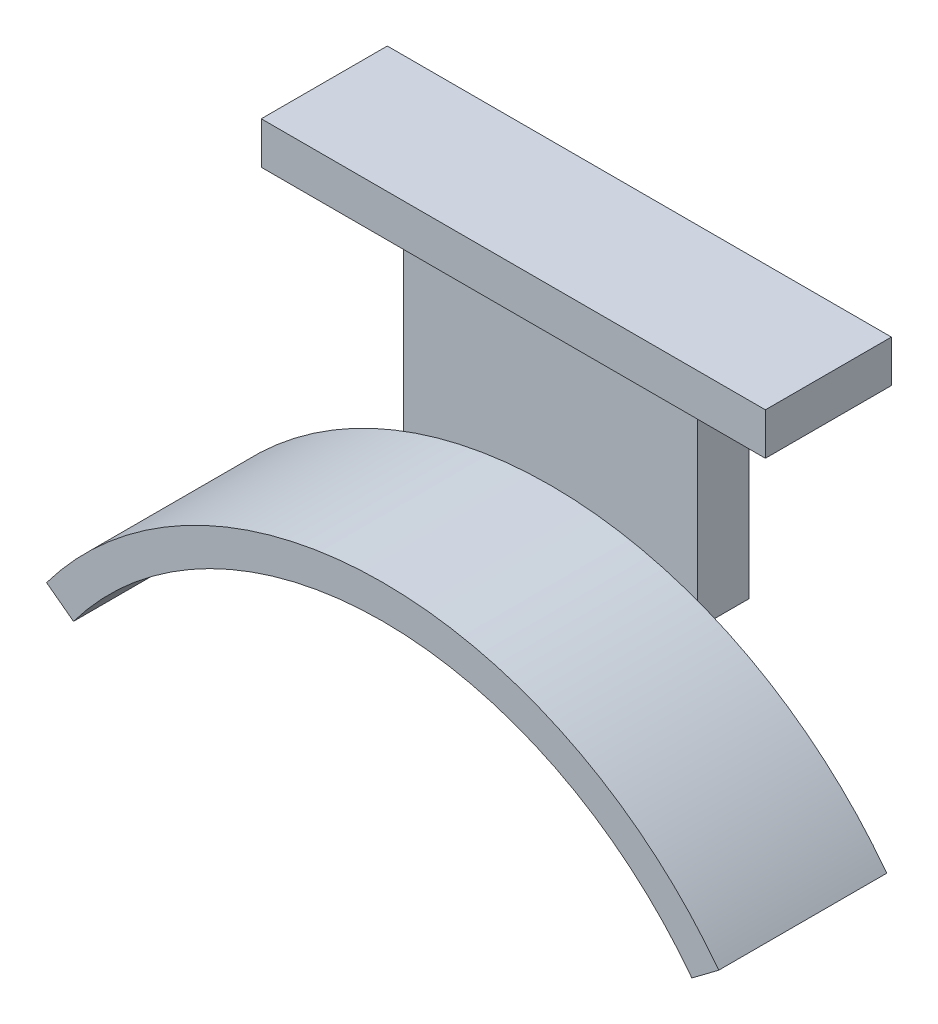
ISO-10303-21;
HEADER;
FILE_DESCRIPTION(('STEP AP214'),'2;1');
FILE_NAME('part.step','',(''),(''),'','','');
FILE_SCHEMA(('AUTOMOTIVE_DESIGN { 1 0 10303 214 1 1 1 1 }'));
ENDSEC;
DATA;
#1=APPLICATION_CONTEXT('core data for automotive mechanical design processes');
#2=APPLICATION_PROTOCOL_DEFINITION('international standard','automotive_design',2000,#1);
#3=PRODUCT_CONTEXT('',#1,'mechanical');
#4=PRODUCT('Part','Part','',(#3));
#5=PRODUCT_RELATED_PRODUCT_CATEGORY('part','',(#4));
#6=PRODUCT_DEFINITION_FORMATION('','',#4);
#7=PRODUCT_DEFINITION_CONTEXT('part definition',#1,'design');
#8=PRODUCT_DEFINITION('design','',#6,#7);
#9=PRODUCT_DEFINITION_SHAPE('','',#8);
#10=(LENGTH_UNIT() NAMED_UNIT(*) SI_UNIT(.MILLI.,.METRE.));
#11=(NAMED_UNIT(*) PLANE_ANGLE_UNIT() SI_UNIT($,.RADIAN.));
#12=(NAMED_UNIT(*) SI_UNIT($,.STERADIAN.) SOLID_ANGLE_UNIT());
#13=UNCERTAINTY_MEASURE_WITH_UNIT(LENGTH_MEASURE(1.E-05),#10,'distance_accuracy_value','');
#14=(GEOMETRIC_REPRESENTATION_CONTEXT(3) GLOBAL_UNCERTAINTY_ASSIGNED_CONTEXT((#13)) GLOBAL_UNIT_ASSIGNED_CONTEXT((#10,
#11,#12)) REPRESENTATION_CONTEXT('',''));
#15=CARTESIAN_POINT('',(0.,0.,0.));
#16=DIRECTION('',(0.,0.,1.));
#17=DIRECTION('',(1.,0.,0.));
#18=AXIS2_PLACEMENT_3D('',#15,#16,#17);
#19=CARTESIAN_POINT('',(0.03715692700383,-88.8999891288398,29.2910047960048));
#20=DIRECTION('',(0.,0.,-1.));
#21=DIRECTION('',(-1.,0.,0.));
#22=AXIS2_PLACEMENT_3D('',#19,#20,#21);
#23=CYLINDRICAL_SURFACE('',#22,58.42);
#24=CARTESIAN_POINT('',(0.03715692700383,-88.8999891288398,3.89100479600479));
#25=DIRECTION('',(0.,0.,1.));
#26=DIRECTION('',(1.,0.,0.));
#27=AXIS2_PLACEMENT_3D('',#24,#25,#26);
#28=CIRCLE('',#27,58.42);
#29=CARTESIAN_POINT('',(-46.7193456955284,-53.875342627995,3.89100479600479));
#30=VERTEX_POINT('',#29);
#31=CARTESIAN_POINT('',(46.7526383021238,-53.8206476314454,3.89100479600479));
#32=VERTEX_POINT('',#31);
#33=EDGE_CURVE('E106',#30,#32,#28,.F.);
#34=ORIENTED_EDGE('',*,*,#33,.T.);
#35=DIRECTION('',(0.,0.,-1.));
#36=VECTOR('',#35,1.);
#37=CARTESIAN_POINT('',(46.7526383021238,-53.8206476314454,29.2910047960048));
#38=LINE('',#37,#36);
#39=CARTESIAN_POINT('',(46.7526383021238,-53.8206476314454,29.2910047960048));
#40=VERTEX_POINT('',#39);
#41=EDGE_CURVE('E12',#40,#32,#38,.T.);
#42=ORIENTED_EDGE('',*,*,#41,.F.);
#43=CARTESIAN_POINT('',(0.03715692700383,-88.8999891288398,29.2910047960048));
#44=DIRECTION('',(0.,0.,1.));
#45=DIRECTION('',(1.,0.,0.));
#46=AXIS2_PLACEMENT_3D('',#43,#44,#45);
#47=CIRCLE('',#46,58.42);
#48=CARTESIAN_POINT('',(-46.7193456955284,-53.875342627995,29.2910047960048));
#49=VERTEX_POINT('',#48);
#50=EDGE_CURVE('E83',#49,#40,#47,.F.);
#51=ORIENTED_EDGE('',*,*,#50,.F.);
#52=DIRECTION('',(0.,0.,-1.));
#53=VECTOR('',#52,1.);
#54=CARTESIAN_POINT('',(-46.7193456955284,-53.875342627995,29.2910047960048));
#55=LINE('',#54,#53);
#56=EDGE_CURVE('E59',#49,#30,#55,.T.);
#57=ORIENTED_EDGE('',*,*,#56,.T.);
#58=EDGE_LOOP('',(#34,#42,#51,#57));
#59=FACE_BOUND('',#58,.T.);
#60=ADVANCED_FACE('F43',(#59),#23,.F.);
#61=CARTESIAN_POINT('',(50.8148540738734,-50.7702701099329,29.2910047960048));
#62=DIRECTION('',(0.60046801604578,-0.799648773966449,0.));
#63=DIRECTION('',(0.799648773966449,0.60046801604578,0.));
#64=AXIS2_PLACEMENT_3D('',#61,#62,#63);
#65=PLANE('',#64);
#66=DIRECTION('',(-0.799648773966449,-0.60046801604578,0.));
#67=VECTOR('',#66,1.);
#68=CARTESIAN_POINT('',(50.8148540738734,-50.7702701099329,3.89100479600479));
#69=LINE('',#68,#67);
#70=CARTESIAN_POINT('',(50.8148540738734,-50.7702701099329,3.89100479600479));
#71=VERTEX_POINT('',#70);
#72=EDGE_CURVE('E92',#71,#32,#69,.T.);
#73=ORIENTED_EDGE('',*,*,#72,.F.);
#74=DIRECTION('',(0.,0.,-1.));
#75=VECTOR('',#74,1.);
#76=CARTESIAN_POINT('',(50.8148540738734,-50.7702701099329,29.2910047960048));
#77=LINE('',#76,#75);
#78=CARTESIAN_POINT('',(50.8148540738734,-50.7702701099329,29.2910047960048));
#79=VERTEX_POINT('',#78);
#80=EDGE_CURVE('E51',#79,#71,#77,.T.);
#81=ORIENTED_EDGE('',*,*,#80,.F.);
#82=DIRECTION('',(-0.799648773966449,-0.60046801604578,0.));
#83=VECTOR('',#82,1.);
#84=CARTESIAN_POINT('',(50.8148540738734,-50.7702701099329,29.2910047960048));
#85=LINE('',#84,#83);
#86=EDGE_CURVE('E90',#79,#40,#85,.T.);
#87=ORIENTED_EDGE('',*,*,#86,.T.);
#88=ORIENTED_EDGE('',*,*,#41,.T.);
#89=EDGE_LOOP('',(#73,#81,#87,#88));
#90=FACE_BOUND('',#89,.T.);
#91=ADVANCED_FACE('F89',(#90),#65,.T.);
#92=CARTESIAN_POINT('',(0.03715692700383,-88.8999891288398,29.2910047960048));
#93=DIRECTION('',(0.,0.,-1.));
#94=DIRECTION('',(-1.,0.,0.));
#95=AXIS2_PLACEMENT_3D('',#92,#93,#94);
#96=CYLINDRICAL_SURFACE('',#95,63.5);
#97=CARTESIAN_POINT('',(0.03715692700383,-88.8999891288398,3.89100479600479));
#98=DIRECTION('',(0.,0.,-1.));
#99=DIRECTION('',(-1.,0.,0.));
#100=AXIS2_PLACEMENT_3D('',#97,#98,#99);
#101=CIRCLE('',#100,63.5);
#102=CARTESIAN_POINT('',(-50.7851285322703,-50.829721193139,3.89100479600479));
#103=VERTEX_POINT('',#102);
#104=EDGE_CURVE('E109',#103,#71,#101,.T.);
#105=ORIENTED_EDGE('',*,*,#104,.F.);
#106=DIRECTION('',(0.,0.,-1.));
#107=VECTOR('',#106,1.);
#108=CARTESIAN_POINT('',(-50.7851285322703,-50.829721193139,29.2910047960048));
#109=LINE('',#108,#107);
#110=CARTESIAN_POINT('',(-50.7851285322703,-50.829721193139,29.2910047960048));
#111=VERTEX_POINT('',#110);
#112=EDGE_CURVE('E72',#111,#103,#109,.T.);
#113=ORIENTED_EDGE('',*,*,#112,.F.);
#114=CARTESIAN_POINT('',(0.03715692700383,-88.8999891288398,29.2910047960048));
#115=DIRECTION('',(0.,0.,-1.));
#116=DIRECTION('',(-1.,0.,0.));
#117=AXIS2_PLACEMENT_3D('',#114,#115,#116);
#118=CIRCLE('',#117,63.5);
#119=EDGE_CURVE('E98',#111,#79,#118,.T.);
#120=ORIENTED_EDGE('',*,*,#119,.T.);
#121=ORIENTED_EDGE('',*,*,#80,.T.);
#122=EDGE_LOOP('',(#105,#113,#120,#121));
#123=FACE_BOUND('',#122,.T.);
#124=ADVANCED_FACE('F100',(#123),#96,.T.);
#125=CARTESIAN_POINT('',(-46.7193456955284,-53.875342627995,29.2910047960048));
#126=DIRECTION('',(-0.599531778514974,-0.800350952114553,0.));
#127=DIRECTION('',(0.800350952114553,-0.599531778514974,0.));
#128=AXIS2_PLACEMENT_3D('',#125,#126,#127);
#129=PLANE('',#128);
#130=DIRECTION('',(-0.800350952114553,0.599531778514974,0.));
#131=VECTOR('',#130,1.);
#132=CARTESIAN_POINT('',(-46.7193456955284,-53.875342627995,3.89100479600479));
#133=LINE('',#132,#131);
#134=EDGE_CURVE('E111',#30,#103,#133,.T.);
#135=ORIENTED_EDGE('',*,*,#134,.F.);
#136=ORIENTED_EDGE('',*,*,#56,.F.);
#137=DIRECTION('',(-0.800350952114553,0.599531778514974,0.));
#138=VECTOR('',#137,1.);
#139=CARTESIAN_POINT('',(-46.7193456955284,-53.875342627995,29.2910047960048));
#140=LINE('',#139,#138);
#141=EDGE_CURVE('E101',#49,#111,#140,.T.);
#142=ORIENTED_EDGE('',*,*,#141,.T.);
#143=ORIENTED_EDGE('',*,*,#112,.T.);
#144=EDGE_LOOP('',(#135,#136,#142,#143));
#145=FACE_BOUND('',#144,.T.);
#146=ADVANCED_FACE('F117',(#145),#129,.T.);
#147=CARTESIAN_POINT('',(0.03715692700383,-88.8999891288398,29.2910047960048));
#148=DIRECTION('',(0.,0.,1.));
#149=DIRECTION('',(1.,0.,0.));
#150=AXIS2_PLACEMENT_3D('',#147,#148,#149);
#151=PLANE('',#150);
#152=ORIENTED_EDGE('',*,*,#50,.T.);
#153=ORIENTED_EDGE('',*,*,#86,.F.);
#154=ORIENTED_EDGE('',*,*,#119,.F.);
#155=ORIENTED_EDGE('',*,*,#141,.F.);
#156=EDGE_LOOP('',(#152,#153,#154,#155));
#157=FACE_BOUND('',#156,.T.);
#158=ADVANCED_FACE('F97',(#157),#151,.T.);
#159=CARTESIAN_POINT('',(0.03715692700383,-88.8999891288398,3.89100479600479));
#160=DIRECTION('',(0.,0.,1.));
#161=DIRECTION('',(1.,0.,0.));
#162=AXIS2_PLACEMENT_3D('',#159,#160,#161);
#163=PLANE('',#162);
#164=ORIENTED_EDGE('',*,*,#33,.F.);
#165=ORIENTED_EDGE('',*,*,#134,.T.);
#166=ORIENTED_EDGE('',*,*,#104,.T.);
#167=ORIENTED_EDGE('',*,*,#72,.T.);
#168=EDGE_LOOP('',(#164,#165,#166,#167));
#169=FACE_BOUND('',#168,.T.);
#170=ADVANCED_FACE('F116',(#169),#163,.F.);
#171=CLOSED_SHELL('',(#60,#91,#124,#146,#158,#170));
#172=MANIFOLD_SOLID_BREP('B2',#171);
#173=CARTESIAN_POINT('',(0.,0.,0.));
#174=DIRECTION('',(0.,1.,0.));
#175=DIRECTION('',(0.,0.,1.));
#176=AXIS2_PLACEMENT_3D('',#173,#174,#175);
#177=PLANE('',#176);
#178=DIRECTION('',(0.,0.,-1.));
#179=VECTOR('',#178,1.);
#180=CARTESIAN_POINT('',(26.035,0.,-3.89100479600479));
#181=LINE('',#180,#179);
#182=CARTESIAN_POINT('',(26.035,0.,7.70100479600477));
#183=VERTEX_POINT('',#182);
#184=CARTESIAN_POINT('',(26.035,0.,-7.70100479600477));
#185=VERTEX_POINT('',#184);
#186=EDGE_CURVE('E298',#183,#185,#181,.T.);
#187=ORIENTED_EDGE('',*,*,#186,.T.);
#188=DIRECTION('',(-1.,0.,0.));
#189=VECTOR('',#188,1.);
#190=CARTESIAN_POINT('',(-22.225,0.,-7.70100479600477));
#191=LINE('',#190,#189);
#192=CARTESIAN_POINT('',(-26.035,0.,-7.70100479600477));
#193=VERTEX_POINT('',#192);
#194=EDGE_CURVE('E304',#185,#193,#191,.T.);
#195=ORIENTED_EDGE('',*,*,#194,.T.);
#196=DIRECTION('',(0.,0.,1.));
#197=VECTOR('',#196,1.);
#198=CARTESIAN_POINT('',(-26.035,0.,3.89100479600479));
#199=LINE('',#198,#197);
#200=CARTESIAN_POINT('',(-26.035,0.,7.70100479600477));
#201=VERTEX_POINT('',#200);
#202=EDGE_CURVE('E302',#193,#201,#199,.T.);
#203=ORIENTED_EDGE('',*,*,#202,.T.);
#204=DIRECTION('',(1.,0.,0.));
#205=VECTOR('',#204,1.);
#206=CARTESIAN_POINT('',(22.225,0.,7.70100479600477));
#207=LINE('',#206,#205);
#208=EDGE_CURVE('E300',#201,#183,#207,.T.);
#209=ORIENTED_EDGE('',*,*,#208,.T.);
#210=EDGE_LOOP('',(#187,#195,#203,#209));
#211=FACE_BOUND('',#210,.T.);
#212=DIRECTION('',(0.,0.,-1.));
#213=VECTOR('',#212,1.);
#214=CARTESIAN_POINT('',(38.1,0.,-9.525));
#215=LINE('',#214,#213);
#216=CARTESIAN_POINT('',(38.1,0.,9.525));
#217=VERTEX_POINT('',#216);
#218=CARTESIAN_POINT('',(38.1,0.,-9.525));
#219=VERTEX_POINT('',#218);
#220=EDGE_CURVE('E260',#217,#219,#215,.T.);
#221=ORIENTED_EDGE('',*,*,#220,.F.);
#222=DIRECTION('',(1.,0.,0.));
#223=VECTOR('',#222,1.);
#224=CARTESIAN_POINT('',(-38.1,0.,9.525));
#225=LINE('',#224,#223);
#226=CARTESIAN_POINT('',(-38.1,0.,9.525));
#227=VERTEX_POINT('',#226);
#228=EDGE_CURVE('E273',#227,#217,#225,.T.);
#229=ORIENTED_EDGE('',*,*,#228,.F.);
#230=DIRECTION('',(0.,0.,1.));
#231=VECTOR('',#230,1.);
#232=CARTESIAN_POINT('',(-38.1,0.,-9.525));
#233=LINE('',#232,#231);
#234=CARTESIAN_POINT('',(-38.1,0.,-9.525));
#235=VERTEX_POINT('',#234);
#236=EDGE_CURVE('E281',#235,#227,#233,.T.);
#237=ORIENTED_EDGE('',*,*,#236,.F.);
#238=DIRECTION('',(-1.,0.,0.));
#239=VECTOR('',#238,1.);
#240=CARTESIAN_POINT('',(-38.1,0.,-9.525));
#241=LINE('',#240,#239);
#242=EDGE_CURVE('E263',#219,#235,#241,.T.);
#243=ORIENTED_EDGE('',*,*,#242,.F.);
#244=EDGE_LOOP('',(#221,#229,#237,#243));
#245=FACE_BOUND('',#244,.T.);
#246=ADVANCED_FACE('F167',(#211,#245),#177,.F.);
#247=CARTESIAN_POINT('',(38.1,6.35,-9.525));
#248=DIRECTION('',(-1.,0.,0.));
#249=DIRECTION('',(0.,0.,1.));
#250=AXIS2_PLACEMENT_3D('',#247,#248,#249);
#251=PLANE('',#250);
#252=ORIENTED_EDGE('',*,*,#220,.T.);
#253=DIRECTION('',(0.,-1.,0.));
#254=VECTOR('',#253,1.);
#255=CARTESIAN_POINT('',(38.1,6.35,-9.525));
#256=LINE('',#255,#254);
#257=CARTESIAN_POINT('',(38.1,6.35,-9.525));
#258=VERTEX_POINT('',#257);
#259=EDGE_CURVE('E292',#258,#219,#256,.T.);
#260=ORIENTED_EDGE('',*,*,#259,.F.);
#261=DIRECTION('',(0.,0.,-1.));
#262=VECTOR('',#261,1.);
#263=CARTESIAN_POINT('',(38.1,6.35,-9.525));
#264=LINE('',#263,#262);
#265=CARTESIAN_POINT('',(38.1,6.35,9.525));
#266=VERTEX_POINT('',#265);
#267=EDGE_CURVE('E269',#266,#258,#264,.T.);
#268=ORIENTED_EDGE('',*,*,#267,.F.);
#269=DIRECTION('',(0.,-1.,0.));
#270=VECTOR('',#269,1.);
#271=CARTESIAN_POINT('',(38.1,6.35,9.525));
#272=LINE('',#271,#270);
#273=EDGE_CURVE('E278',#266,#217,#272,.T.);
#274=ORIENTED_EDGE('',*,*,#273,.T.);
#275=EDGE_LOOP('',(#252,#260,#268,#274));
#276=FACE_BOUND('',#275,.T.);
#277=ADVANCED_FACE('F354',(#276),#251,.F.);
#278=CARTESIAN_POINT('',(-38.1,6.35,-9.525));
#279=DIRECTION('',(0.,0.,1.));
#280=DIRECTION('',(1.,0.,0.));
#281=AXIS2_PLACEMENT_3D('',#278,#279,#280);
#282=PLANE('',#281);
#283=ORIENTED_EDGE('',*,*,#242,.T.);
#284=DIRECTION('',(0.,-1.,0.));
#285=VECTOR('',#284,1.);
#286=CARTESIAN_POINT('',(-38.1,6.35,-9.525));
#287=LINE('',#286,#285);
#288=CARTESIAN_POINT('',(-38.1,6.35,-9.525));
#289=VERTEX_POINT('',#288);
#290=EDGE_CURVE('E289',#289,#235,#287,.T.);
#291=ORIENTED_EDGE('',*,*,#290,.F.);
#292=DIRECTION('',(-1.,0.,0.));
#293=VECTOR('',#292,1.);
#294=CARTESIAN_POINT('',(-38.1,6.35,-9.525));
#295=LINE('',#294,#293);
#296=EDGE_CURVE('E272',#258,#289,#295,.T.);
#297=ORIENTED_EDGE('',*,*,#296,.F.);
#298=ORIENTED_EDGE('',*,*,#259,.T.);
#299=EDGE_LOOP('',(#283,#291,#297,#298));
#300=FACE_BOUND('',#299,.T.);
#301=ADVANCED_FACE('F359',(#300),#282,.F.);
#302=CARTESIAN_POINT('',(-38.1,6.35,-9.525));
#303=DIRECTION('',(1.,0.,0.));
#304=DIRECTION('',(0.,0.,-1.));
#305=AXIS2_PLACEMENT_3D('',#302,#303,#304);
#306=PLANE('',#305);
#307=ORIENTED_EDGE('',*,*,#236,.T.);
#308=DIRECTION('',(0.,-1.,0.));
#309=VECTOR('',#308,1.);
#310=CARTESIAN_POINT('',(-38.1,6.35,9.525));
#311=LINE('',#310,#309);
#312=CARTESIAN_POINT('',(-38.1,6.35,9.525));
#313=VERTEX_POINT('',#312);
#314=EDGE_CURVE('E286',#313,#227,#311,.T.);
#315=ORIENTED_EDGE('',*,*,#314,.F.);
#316=DIRECTION('',(0.,0.,1.));
#317=VECTOR('',#316,1.);
#318=CARTESIAN_POINT('',(-38.1,6.35,-9.525));
#319=LINE('',#318,#317);
#320=EDGE_CURVE('E275',#289,#313,#319,.T.);
#321=ORIENTED_EDGE('',*,*,#320,.F.);
#322=ORIENTED_EDGE('',*,*,#290,.T.);
#323=EDGE_LOOP('',(#307,#315,#321,#322));
#324=FACE_BOUND('',#323,.T.);
#325=ADVANCED_FACE('F369',(#324),#306,.F.);
#326=CARTESIAN_POINT('',(-38.1,6.35,9.525));
#327=DIRECTION('',(0.,0.,-1.));
#328=DIRECTION('',(-1.,0.,0.));
#329=AXIS2_PLACEMENT_3D('',#326,#327,#328);
#330=PLANE('',#329);
#331=ORIENTED_EDGE('',*,*,#228,.T.);
#332=ORIENTED_EDGE('',*,*,#273,.F.);
#333=DIRECTION('',(1.,0.,0.));
#334=VECTOR('',#333,1.);
#335=CARTESIAN_POINT('',(-38.1,6.35,9.525));
#336=LINE('',#335,#334);
#337=EDGE_CURVE('E277',#313,#266,#336,.T.);
#338=ORIENTED_EDGE('',*,*,#337,.F.);
#339=ORIENTED_EDGE('',*,*,#314,.T.);
#340=EDGE_LOOP('',(#331,#332,#338,#339));
#341=FACE_BOUND('',#340,.T.);
#342=ADVANCED_FACE('F366',(#341),#330,.F.);
#343=CARTESIAN_POINT('',(0.,6.35,0.));
#344=DIRECTION('',(0.,1.,0.));
#345=DIRECTION('',(0.,0.,1.));
#346=AXIS2_PLACEMENT_3D('',#343,#344,#345);
#347=PLANE('',#346);
#348=ORIENTED_EDGE('',*,*,#267,.T.);
#349=ORIENTED_EDGE('',*,*,#296,.T.);
#350=ORIENTED_EDGE('',*,*,#320,.T.);
#351=ORIENTED_EDGE('',*,*,#337,.T.);
#352=EDGE_LOOP('',(#348,#349,#350,#351));
#353=FACE_BOUND('',#352,.T.);
#354=ADVANCED_FACE('F364',(#353),#347,.T.);
#355=CARTESIAN_POINT('',(22.225,-33.02,3.89100479600479));
#356=DIRECTION('',(-1.,0.,0.));
#357=DIRECTION('',(0.,0.,1.));
#358=AXIS2_PLACEMENT_3D('',#355,#356,#357);
#359=PLANE('',#358);
#360=DIRECTION('',(0.,1.,0.));
#361=VECTOR('',#360,1.);
#362=CARTESIAN_POINT('',(22.225,-33.02,-3.89100479600479));
#363=LINE('',#362,#361);
#364=CARTESIAN_POINT('',(22.225,-33.02,-3.89100479600479));
#365=VERTEX_POINT('',#364);
#366=CARTESIAN_POINT('',(22.225,-3.81000000000002,-3.89100479600479));
#367=VERTEX_POINT('',#366);
#368=EDGE_CURVE('E338',#365,#367,#363,.T.);
#369=ORIENTED_EDGE('',*,*,#368,.T.);
#370=DIRECTION('',(0.,0.,1.));
#371=VECTOR('',#370,1.);
#372=CARTESIAN_POINT('',(22.225,-3.81000000000002,3.89100479600479));
#373=LINE('',#372,#371);
#374=CARTESIAN_POINT('',(22.225,-3.81000000000002,3.89100479600479));
#375=VERTEX_POINT('',#374);
#376=EDGE_CURVE('E41',#367,#375,#373,.T.);
#377=ORIENTED_EDGE('',*,*,#376,.T.);
#378=DIRECTION('',(0.,1.,0.));
#379=VECTOR('',#378,1.);
#380=CARTESIAN_POINT('',(22.225,-33.02,3.89100479600479));
#381=LINE('',#380,#379);
#382=CARTESIAN_POINT('',(22.225,-33.02,3.89100479600479));
#383=VERTEX_POINT('',#382);
#384=EDGE_CURVE('E246',#383,#375,#381,.T.);
#385=ORIENTED_EDGE('',*,*,#384,.F.);
#386=DIRECTION('',(0.,0.,1.));
#387=VECTOR('',#386,1.);
#388=CARTESIAN_POINT('',(22.225,-33.02,3.89100479600479));
#389=LINE('',#388,#387);
#390=EDGE_CURVE('E251',#365,#383,#389,.T.);
#391=ORIENTED_EDGE('',*,*,#390,.F.);
#392=EDGE_LOOP('',(#369,#377,#385,#391));
#393=FACE_BOUND('',#392,.T.);
#394=ADVANCED_FACE('F259',(#393),#359,.F.);
#395=CARTESIAN_POINT('',(-22.225,-33.02,3.89100479600479));
#396=DIRECTION('',(0.,0.,-1.));
#397=DIRECTION('',(-1.,0.,0.));
#398=AXIS2_PLACEMENT_3D('',#395,#396,#397);
#399=PLANE('',#398);
#400=ORIENTED_EDGE('',*,*,#384,.T.);
#401=DIRECTION('',(-1.,0.,0.));
#402=VECTOR('',#401,1.);
#403=CARTESIAN_POINT('',(-22.225,-3.81000000000002,3.89100479600479));
#404=LINE('',#403,#402);
#405=CARTESIAN_POINT('',(-22.225,-3.81000000000002,3.89100479600479));
#406=VERTEX_POINT('',#405);
#407=EDGE_CURVE('E176',#375,#406,#404,.T.);
#408=ORIENTED_EDGE('',*,*,#407,.T.);
#409=DIRECTION('',(0.,1.,0.));
#410=VECTOR('',#409,1.);
#411=CARTESIAN_POINT('',(-22.225,-33.02,3.89100479600479));
#412=LINE('',#411,#410);
#413=CARTESIAN_POINT('',(-22.225,-33.02,3.89100479600479));
#414=VERTEX_POINT('',#413);
#415=EDGE_CURVE('E247',#414,#406,#412,.T.);
#416=ORIENTED_EDGE('',*,*,#415,.F.);
#417=DIRECTION('',(-1.,0.,0.));
#418=VECTOR('',#417,1.);
#419=CARTESIAN_POINT('',(-22.225,-33.02,3.89100479600479));
#420=LINE('',#419,#418);
#421=EDGE_CURVE('E243',#383,#414,#420,.T.);
#422=ORIENTED_EDGE('',*,*,#421,.F.);
#423=EDGE_LOOP('',(#400,#408,#416,#422));
#424=FACE_BOUND('',#423,.T.);
#425=ADVANCED_FACE('F245',(#424),#399,.F.);
#426=CARTESIAN_POINT('',(-22.225,-33.02,3.89100479600479));
#427=DIRECTION('',(1.,0.,0.));
#428=DIRECTION('',(0.,0.,-1.));
#429=AXIS2_PLACEMENT_3D('',#426,#427,#428);
#430=PLANE('',#429);
#431=ORIENTED_EDGE('',*,*,#415,.T.);
#432=DIRECTION('',(0.,0.,-1.));
#433=VECTOR('',#432,1.);
#434=CARTESIAN_POINT('',(-22.225,-3.81000000000002,-3.89100479600479));
#435=LINE('',#434,#433);
#436=CARTESIAN_POINT('',(-22.225,-3.81000000000002,-3.89100479600479));
#437=VERTEX_POINT('',#436);
#438=EDGE_CURVE('E307',#406,#437,#435,.T.);
#439=ORIENTED_EDGE('',*,*,#438,.T.);
#440=DIRECTION('',(0.,1.,0.));
#441=VECTOR('',#440,1.);
#442=CARTESIAN_POINT('',(-22.225,-33.02,-3.89100479600479));
#443=LINE('',#442,#441);
#444=CARTESIAN_POINT('',(-22.225,-33.02,-3.89100479600479));
#445=VERTEX_POINT('',#444);
#446=EDGE_CURVE('E265',#445,#437,#443,.T.);
#447=ORIENTED_EDGE('',*,*,#446,.F.);
#448=DIRECTION('',(0.,0.,-1.));
#449=VECTOR('',#448,1.);
#450=CARTESIAN_POINT('',(-22.225,-33.02,3.89100479600479));
#451=LINE('',#450,#449);
#452=EDGE_CURVE('E250',#414,#445,#451,.T.);
#453=ORIENTED_EDGE('',*,*,#452,.F.);
#454=EDGE_LOOP('',(#431,#439,#447,#453));
#455=FACE_BOUND('',#454,.T.);
#456=ADVANCED_FACE('F344',(#455),#430,.F.);
#457=CARTESIAN_POINT('',(-22.225,-33.02,-3.89100479600479));
#458=DIRECTION('',(0.,0.,1.));
#459=DIRECTION('',(1.,0.,0.));
#460=AXIS2_PLACEMENT_3D('',#457,#458,#459);
#461=PLANE('',#460);
#462=ORIENTED_EDGE('',*,*,#446,.T.);
#463=DIRECTION('',(1.,0.,0.));
#464=VECTOR('',#463,1.);
#465=CARTESIAN_POINT('',(22.225,-3.81000000000002,-3.89100479600479));
#466=LINE('',#465,#464);
#467=EDGE_CURVE('E295',#437,#367,#466,.T.);
#468=ORIENTED_EDGE('',*,*,#467,.T.);
#469=ORIENTED_EDGE('',*,*,#368,.F.);
#470=DIRECTION('',(1.,0.,0.));
#471=VECTOR('',#470,1.);
#472=CARTESIAN_POINT('',(-22.225,-33.02,-3.89100479600479));
#473=LINE('',#472,#471);
#474=EDGE_CURVE('E256',#445,#365,#473,.T.);
#475=ORIENTED_EDGE('',*,*,#474,.F.);
#476=EDGE_LOOP('',(#462,#468,#469,#475));
#477=FACE_BOUND('',#476,.T.);
#478=ADVANCED_FACE('F337',(#477),#461,.F.);
#479=CARTESIAN_POINT('',(0.,-33.02,0.));
#480=DIRECTION('',(0.,-1.,0.));
#481=DIRECTION('',(0.,0.,-1.));
#482=AXIS2_PLACEMENT_3D('',#479,#480,#481);
#483=PLANE('',#482);
#484=ORIENTED_EDGE('',*,*,#390,.T.);
#485=ORIENTED_EDGE('',*,*,#421,.T.);
#486=ORIENTED_EDGE('',*,*,#452,.T.);
#487=ORIENTED_EDGE('',*,*,#474,.T.);
#488=EDGE_LOOP('',(#484,#485,#486,#487));
#489=FACE_BOUND('',#488,.T.);
#490=ADVANCED_FACE('F254',(#489),#483,.T.);
#491=CARTESIAN_POINT('',(-22.225,-3.81000000000002,3.89100479600479));
#492=DIRECTION('',(0.,-0.707106781186543,0.707106781186552));
#493=DIRECTION('',(1.,0.,0.));
#494=AXIS2_PLACEMENT_3D('',#491,#492,#493);
#495=PLANE('',#494);
#496=DIRECTION('',(-0.577350269189623,-0.577350269189631,-0.577350269189623));
#497=VECTOR('',#496,1.);
#498=CARTESIAN_POINT('',(22.225,-3.81000000000002,3.89100479600479));
#499=LINE('',#498,#497);
#500=EDGE_CURVE('E313',#183,#375,#499,.T.);
#501=ORIENTED_EDGE('',*,*,#500,.F.);
#502=ORIENTED_EDGE('',*,*,#208,.F.);
#503=DIRECTION('',(0.577350269189623,-0.577350269189631,-0.577350269189623));
#504=VECTOR('',#503,1.);
#505=CARTESIAN_POINT('',(-22.225,-3.81000000000002,3.89100479600479));
#506=LINE('',#505,#504);
#507=EDGE_CURVE('E171',#406,#201,#506,.F.);
#508=ORIENTED_EDGE('',*,*,#507,.F.);
#509=ORIENTED_EDGE('',*,*,#407,.F.);
#510=EDGE_LOOP('',(#501,#502,#508,#509));
#511=FACE_BOUND('',#510,.T.);
#512=ADVANCED_FACE('F169',(#511),#495,.T.);
#513=CARTESIAN_POINT('',(-22.225,-3.81000000000002,3.89100479600479));
#514=DIRECTION('',(-0.707106781186552,-0.707106781186543,0.));
#515=DIRECTION('',(0.,0.,1.));
#516=AXIS2_PLACEMENT_3D('',#513,#514,#515);
#517=PLANE('',#516);
#518=ORIENTED_EDGE('',*,*,#507,.T.);
#519=ORIENTED_EDGE('',*,*,#202,.F.);
#520=DIRECTION('',(0.577350269189623,-0.577350269189631,0.577350269189623));
#521=VECTOR('',#520,1.);
#522=CARTESIAN_POINT('',(-19.6309968026635,-6.40400319733656,-1.29700159866829));
#523=LINE('',#522,#521);
#524=EDGE_CURVE('E312',#437,#193,#523,.F.);
#525=ORIENTED_EDGE('',*,*,#524,.F.);
#526=ORIENTED_EDGE('',*,*,#438,.F.);
#527=EDGE_LOOP('',(#518,#519,#525,#526));
#528=FACE_BOUND('',#527,.T.);
#529=ADVANCED_FACE('F323',(#528),#517,.T.);
#530=CARTESIAN_POINT('',(22.225,-3.81000000000002,3.89100479600479));
#531=DIRECTION('',(0.707106781186552,-0.707106781186543,0.));
#532=DIRECTION('',(0.,0.,-1.));
#533=AXIS2_PLACEMENT_3D('',#530,#531,#532);
#534=PLANE('',#533);
#535=ORIENTED_EDGE('',*,*,#500,.T.);
#536=ORIENTED_EDGE('',*,*,#376,.F.);
#537=DIRECTION('',(0.577350269189623,0.577350269189631,-0.577350269189623));
#538=VECTOR('',#537,1.);
#539=CARTESIAN_POINT('',(19.6309968026635,-6.40400319733656,-1.29700159866829));
#540=LINE('',#539,#538);
#541=EDGE_CURVE('E310',#185,#367,#540,.F.);
#542=ORIENTED_EDGE('',*,*,#541,.F.);
#543=ORIENTED_EDGE('',*,*,#186,.F.);
#544=EDGE_LOOP('',(#535,#536,#542,#543));
#545=FACE_BOUND('',#544,.T.);
#546=ADVANCED_FACE('F334',(#545),#534,.T.);
#547=CARTESIAN_POINT('',(-22.225,-3.81000000000002,-3.89100479600479));
#548=DIRECTION('',(0.,-0.707106781186543,-0.707106781186552));
#549=DIRECTION('',(-1.,0.,0.));
#550=AXIS2_PLACEMENT_3D('',#547,#548,#549);
#551=PLANE('',#550);
#552=ORIENTED_EDGE('',*,*,#524,.T.);
#553=ORIENTED_EDGE('',*,*,#194,.F.);
#554=ORIENTED_EDGE('',*,*,#541,.T.);
#555=ORIENTED_EDGE('',*,*,#467,.F.);
#556=EDGE_LOOP('',(#552,#553,#554,#555));
#557=FACE_BOUND('',#556,.T.);
#558=ADVANCED_FACE('F332',(#557),#551,.T.);
#559=CLOSED_SHELL('',(#246,#277,#301,#325,#342,#354,#394,#425,#456,#478,#490,#512,#529,#546,#558));
#560=MANIFOLD_SOLID_BREP('B6',#559);
#561=ADVANCED_BREP_SHAPE_REPRESENTATION('',(#18,#172,#560),#14);
#562=SHAPE_DEFINITION_REPRESENTATION(#9,#561);
ENDSEC;
END-ISO-10303-21;
